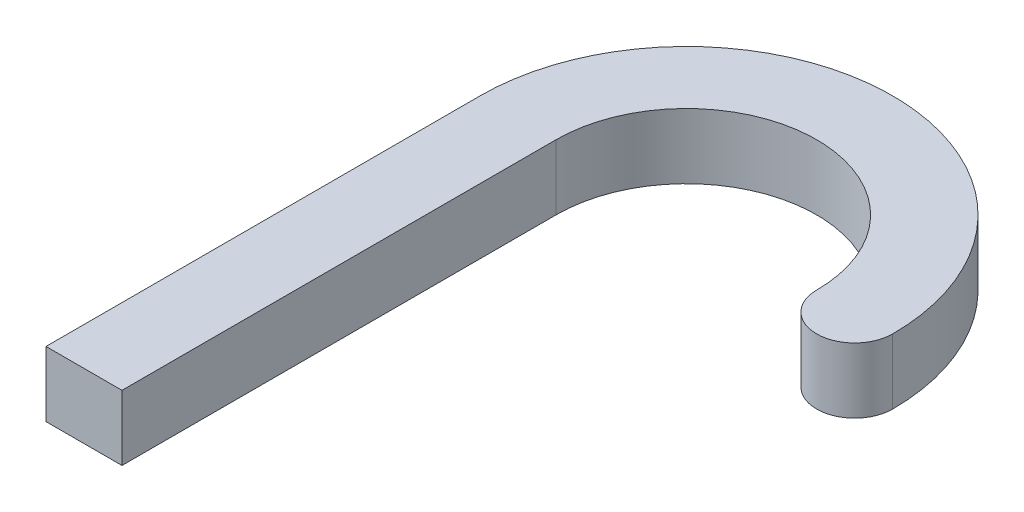
ISO-10303-21;
HEADER;
FILE_DESCRIPTION(('STEP AP214'),'2;1');
FILE_NAME('part.step','',(''),(''),'','','');
FILE_SCHEMA(('AUTOMOTIVE_DESIGN { 1 0 10303 214 1 1 1 1 }'));
ENDSEC;
DATA;
#1=APPLICATION_CONTEXT('core data for automotive mechanical design processes');
#2=APPLICATION_PROTOCOL_DEFINITION('international standard','automotive_design',2000,#1);
#3=PRODUCT_CONTEXT('',#1,'mechanical');
#4=PRODUCT('Part','Part','',(#3));
#5=PRODUCT_RELATED_PRODUCT_CATEGORY('part','',(#4));
#6=PRODUCT_DEFINITION_FORMATION('','',#4);
#7=PRODUCT_DEFINITION_CONTEXT('part definition',#1,'design');
#8=PRODUCT_DEFINITION('design','',#6,#7);
#9=PRODUCT_DEFINITION_SHAPE('','',#8);
#10=(LENGTH_UNIT() NAMED_UNIT(*) SI_UNIT(.MILLI.,.METRE.));
#11=(NAMED_UNIT(*) PLANE_ANGLE_UNIT() SI_UNIT($,.RADIAN.));
#12=(NAMED_UNIT(*) SI_UNIT($,.STERADIAN.) SOLID_ANGLE_UNIT());
#13=UNCERTAINTY_MEASURE_WITH_UNIT(LENGTH_MEASURE(1.E-05),#10,'distance_accuracy_value','');
#14=(GEOMETRIC_REPRESENTATION_CONTEXT(3) GLOBAL_UNCERTAINTY_ASSIGNED_CONTEXT((#13)) GLOBAL_UNIT_ASSIGNED_CONTEXT((#10,
#11,#12)) REPRESENTATION_CONTEXT('',''));
#15=CARTESIAN_POINT('',(0.,0.,0.));
#16=DIRECTION('',(0.,0.,1.));
#17=DIRECTION('',(1.,0.,0.));
#18=AXIS2_PLACEMENT_3D('',#15,#16,#17);
#19=CARTESIAN_POINT('',(0.,3.,0.));
#20=DIRECTION('',(1.,0.,0.));
#21=DIRECTION('',(0.,0.,-1.));
#22=AXIS2_PLACEMENT_3D('',#19,#20,#21);
#23=PLANE('',#22);
#24=DIRECTION('',(0.,0.,1.));
#25=VECTOR('',#24,1.);
#26=CARTESIAN_POINT('',(0.,0.,0.));
#27=LINE('',#26,#25);
#28=CARTESIAN_POINT('',(0.,0.,-20.));
#29=VERTEX_POINT('',#28);
#30=CARTESIAN_POINT('',(0.,0.,0.));
#31=VERTEX_POINT('',#30);
#32=EDGE_CURVE('E134',#29,#31,#27,.T.);
#33=ORIENTED_EDGE('',*,*,#32,.T.);
#34=DIRECTION('',(0.,-1.,0.));
#35=VECTOR('',#34,1.);
#36=CARTESIAN_POINT('',(0.,3.,0.));
#37=LINE('',#36,#35);
#38=CARTESIAN_POINT('',(0.,3.,0.));
#39=VERTEX_POINT('',#38);
#40=EDGE_CURVE('E11',#39,#31,#37,.T.);
#41=ORIENTED_EDGE('',*,*,#40,.F.);
#42=DIRECTION('',(0.,0.,1.));
#43=VECTOR('',#42,1.);
#44=CARTESIAN_POINT('',(0.,3.,0.));
#45=LINE('',#44,#43);
#46=CARTESIAN_POINT('',(0.,3.,-20.));
#47=VERTEX_POINT('',#46);
#48=EDGE_CURVE('E150',#47,#39,#45,.T.);
#49=ORIENTED_EDGE('',*,*,#48,.F.);
#50=DIRECTION('',(0.,-1.,0.));
#51=VECTOR('',#50,1.);
#52=CARTESIAN_POINT('',(0.,3.,-20.));
#53=LINE('',#52,#51);
#54=EDGE_CURVE('E130',#47,#29,#53,.T.);
#55=ORIENTED_EDGE('',*,*,#54,.T.);
#56=EDGE_LOOP('',(#33,#41,#49,#55));
#57=FACE_BOUND('',#56,.T.);
#58=ADVANCED_FACE('F45',(#57),#23,.F.);
#59=CARTESIAN_POINT('',(0.,3.,0.));
#60=DIRECTION('',(0.,0.,-1.));
#61=DIRECTION('',(-1.,0.,0.));
#62=AXIS2_PLACEMENT_3D('',#59,#60,#61);
#63=PLANE('',#62);
#64=DIRECTION('',(1.,0.,0.));
#65=VECTOR('',#64,1.);
#66=CARTESIAN_POINT('',(0.,0.,0.));
#67=LINE('',#66,#65);
#68=CARTESIAN_POINT('',(3.5,0.,0.));
#69=VERTEX_POINT('',#68);
#70=EDGE_CURVE('E138',#31,#69,#67,.T.);
#71=ORIENTED_EDGE('',*,*,#70,.T.);
#72=DIRECTION('',(0.,-1.,0.));
#73=VECTOR('',#72,1.);
#74=CARTESIAN_POINT('',(3.5,3.,0.));
#75=LINE('',#74,#73);
#76=CARTESIAN_POINT('',(3.5,3.,0.));
#77=VERTEX_POINT('',#76);
#78=EDGE_CURVE('E54',#77,#69,#75,.T.);
#79=ORIENTED_EDGE('',*,*,#78,.F.);
#80=DIRECTION('',(1.,0.,0.));
#81=VECTOR('',#80,1.);
#82=CARTESIAN_POINT('',(0.,3.,0.));
#83=LINE('',#82,#81);
#84=EDGE_CURVE('E99',#39,#77,#83,.T.);
#85=ORIENTED_EDGE('',*,*,#84,.F.);
#86=ORIENTED_EDGE('',*,*,#40,.T.);
#87=EDGE_LOOP('',(#71,#79,#85,#86));
#88=FACE_BOUND('',#87,.T.);
#89=ADVANCED_FACE('F178',(#88),#63,.F.);
#90=CARTESIAN_POINT('',(3.5,3.,0.));
#91=DIRECTION('',(-1.,0.,0.));
#92=DIRECTION('',(0.,0.,1.));
#93=AXIS2_PLACEMENT_3D('',#90,#91,#92);
#94=PLANE('',#93);
#95=DIRECTION('',(0.,0.,-1.));
#96=VECTOR('',#95,1.);
#97=CARTESIAN_POINT('',(3.5,0.,0.));
#98=LINE('',#97,#96);
#99=CARTESIAN_POINT('',(3.5,0.,-20.));
#100=VERTEX_POINT('',#99);
#101=EDGE_CURVE('E141',#69,#100,#98,.T.);
#102=ORIENTED_EDGE('',*,*,#101,.T.);
#103=DIRECTION('',(0.,-1.,0.));
#104=VECTOR('',#103,1.);
#105=CARTESIAN_POINT('',(3.5,3.,-20.));
#106=LINE('',#105,#104);
#107=CARTESIAN_POINT('',(3.5,3.,-20.));
#108=VERTEX_POINT('',#107);
#109=EDGE_CURVE('E123',#108,#100,#106,.T.);
#110=ORIENTED_EDGE('',*,*,#109,.F.);
#111=DIRECTION('',(0.,0.,-1.));
#112=VECTOR('',#111,1.);
#113=CARTESIAN_POINT('',(3.5,3.,0.));
#114=LINE('',#113,#112);
#115=EDGE_CURVE('E112',#77,#108,#114,.T.);
#116=ORIENTED_EDGE('',*,*,#115,.F.);
#117=ORIENTED_EDGE('',*,*,#78,.T.);
#118=EDGE_LOOP('',(#102,#110,#116,#117));
#119=FACE_BOUND('',#118,.T.);
#120=ADVANCED_FACE('F160',(#119),#94,.F.);
#121=CARTESIAN_POINT('',(9.5,3.,-20.));
#122=DIRECTION('',(0.,-1.,0.));
#123=DIRECTION('',(0.,0.,-1.));
#124=AXIS2_PLACEMENT_3D('',#121,#122,#123);
#125=CYLINDRICAL_SURFACE('',#124,6.);
#126=CARTESIAN_POINT('',(9.5,0.,-20.));
#127=DIRECTION('',(0.,-1.,0.));
#128=DIRECTION('',(0.,0.,1.));
#129=AXIS2_PLACEMENT_3D('',#126,#127,#128);
#130=CIRCLE('',#129,6.);
#131=CARTESIAN_POINT('',(15.5,0.,-20.));
#132=VERTEX_POINT('',#131);
#133=EDGE_CURVE('E121',#100,#132,#130,.T.);
#134=ORIENTED_EDGE('',*,*,#133,.T.);
#135=DIRECTION('',(0.,-1.,0.));
#136=VECTOR('',#135,1.);
#137=CARTESIAN_POINT('',(15.5,3.,-20.));
#138=LINE('',#137,#136);
#139=CARTESIAN_POINT('',(15.5,3.,-20.));
#140=VERTEX_POINT('',#139);
#141=EDGE_CURVE('E118',#140,#132,#138,.T.);
#142=ORIENTED_EDGE('',*,*,#141,.F.);
#143=CARTESIAN_POINT('',(9.5,3.,-20.));
#144=DIRECTION('',(0.,-1.,0.));
#145=DIRECTION('',(0.,0.,1.));
#146=AXIS2_PLACEMENT_3D('',#143,#144,#145);
#147=CIRCLE('',#146,6.);
#148=EDGE_CURVE('E106',#108,#140,#147,.T.);
#149=ORIENTED_EDGE('',*,*,#148,.F.);
#150=ORIENTED_EDGE('',*,*,#109,.T.);
#151=EDGE_LOOP('',(#134,#142,#149,#150));
#152=FACE_BOUND('',#151,.T.);
#153=ADVANCED_FACE('F119',(#152),#125,.F.);
#154=CARTESIAN_POINT('',(17.25,3.,-20.));
#155=DIRECTION('',(0.,-1.,0.));
#156=DIRECTION('',(0.,0.,-1.));
#157=AXIS2_PLACEMENT_3D('',#154,#155,#156);
#158=CYLINDRICAL_SURFACE('',#157,1.75);
#159=CARTESIAN_POINT('',(17.25,0.,-20.));
#160=DIRECTION('',(0.,1.,0.));
#161=DIRECTION('',(0.,0.,-1.));
#162=AXIS2_PLACEMENT_3D('',#159,#160,#161);
#163=CIRCLE('',#162,1.75);
#164=CARTESIAN_POINT('',(19.,0.,-20.));
#165=VERTEX_POINT('',#164);
#166=EDGE_CURVE('E85',#132,#165,#163,.T.);
#167=ORIENTED_EDGE('',*,*,#166,.T.);
#168=DIRECTION('',(0.,-1.,0.));
#169=VECTOR('',#168,1.);
#170=CARTESIAN_POINT('',(19.,3.,-20.));
#171=LINE('',#170,#169);
#172=CARTESIAN_POINT('',(19.,3.,-20.));
#173=VERTEX_POINT('',#172);
#174=EDGE_CURVE('E124',#173,#165,#171,.T.);
#175=ORIENTED_EDGE('',*,*,#174,.F.);
#176=CARTESIAN_POINT('',(17.25,3.,-20.));
#177=DIRECTION('',(0.,1.,0.));
#178=DIRECTION('',(0.,0.,-1.));
#179=AXIS2_PLACEMENT_3D('',#176,#177,#178);
#180=CIRCLE('',#179,1.75);
#181=EDGE_CURVE('E110',#140,#173,#180,.T.);
#182=ORIENTED_EDGE('',*,*,#181,.F.);
#183=ORIENTED_EDGE('',*,*,#141,.T.);
#184=EDGE_LOOP('',(#167,#175,#182,#183));
#185=FACE_BOUND('',#184,.T.);
#186=ADVANCED_FACE('F126',(#185),#158,.T.);
#187=CARTESIAN_POINT('',(9.5,3.,-20.));
#188=DIRECTION('',(0.,-1.,0.));
#189=DIRECTION('',(0.,0.,-1.));
#190=AXIS2_PLACEMENT_3D('',#187,#188,#189);
#191=CYLINDRICAL_SURFACE('',#190,9.5);
#192=CARTESIAN_POINT('',(9.5,0.,-20.));
#193=DIRECTION('',(0.,1.,0.));
#194=DIRECTION('',(0.,0.,-1.));
#195=AXIS2_PLACEMENT_3D('',#192,#193,#194);
#196=CIRCLE('',#195,9.5);
#197=EDGE_CURVE('E91',#165,#29,#196,.T.);
#198=ORIENTED_EDGE('',*,*,#197,.T.);
#199=ORIENTED_EDGE('',*,*,#54,.F.);
#200=CARTESIAN_POINT('',(9.5,3.,-20.));
#201=DIRECTION('',(0.,1.,0.));
#202=DIRECTION('',(0.,0.,-1.));
#203=AXIS2_PLACEMENT_3D('',#200,#201,#202);
#204=CIRCLE('',#203,9.5);
#205=EDGE_CURVE('E62',#173,#47,#204,.T.);
#206=ORIENTED_EDGE('',*,*,#205,.F.);
#207=ORIENTED_EDGE('',*,*,#174,.T.);
#208=EDGE_LOOP('',(#198,#199,#206,#207));
#209=FACE_BOUND('',#208,.T.);
#210=ADVANCED_FACE('F167',(#209),#191,.T.);
#211=CARTESIAN_POINT('',(9.5,3.,-20.));
#212=DIRECTION('',(0.,-1.,0.));
#213=DIRECTION('',(0.,0.,-1.));
#214=AXIS2_PLACEMENT_3D('',#211,#212,#213);
#215=PLANE('',#214);
#216=ORIENTED_EDGE('',*,*,#48,.T.);
#217=ORIENTED_EDGE('',*,*,#84,.T.);
#218=ORIENTED_EDGE('',*,*,#115,.T.);
#219=ORIENTED_EDGE('',*,*,#148,.T.);
#220=ORIENTED_EDGE('',*,*,#181,.T.);
#221=ORIENTED_EDGE('',*,*,#205,.T.);
#222=EDGE_LOOP('',(#216,#217,#218,#219,#220,#221));
#223=FACE_BOUND('',#222,.T.);
#224=ADVANCED_FACE('F108',(#223),#215,.F.);
#225=CARTESIAN_POINT('',(9.5,0.,-20.));
#226=DIRECTION('',(0.,-1.,0.));
#227=DIRECTION('',(0.,0.,-1.));
#228=AXIS2_PLACEMENT_3D('',#225,#226,#227);
#229=PLANE('',#228);
#230=ORIENTED_EDGE('',*,*,#32,.F.);
#231=ORIENTED_EDGE('',*,*,#197,.F.);
#232=ORIENTED_EDGE('',*,*,#166,.F.);
#233=ORIENTED_EDGE('',*,*,#133,.F.);
#234=ORIENTED_EDGE('',*,*,#101,.F.);
#235=ORIENTED_EDGE('',*,*,#70,.F.);
#236=EDGE_LOOP('',(#230,#231,#232,#233,#234,#235));
#237=FACE_BOUND('',#236,.T.);
#238=ADVANCED_FACE('F163',(#237),#229,.T.);
#239=CLOSED_SHELL('',(#58,#89,#120,#153,#186,#210,#224,#238));
#240=MANIFOLD_SOLID_BREP('B2',#239);
#241=ADVANCED_BREP_SHAPE_REPRESENTATION('',(#18,#240),#14);
#242=SHAPE_DEFINITION_REPRESENTATION(#9,#241);
ENDSEC;
END-ISO-10303-21;
